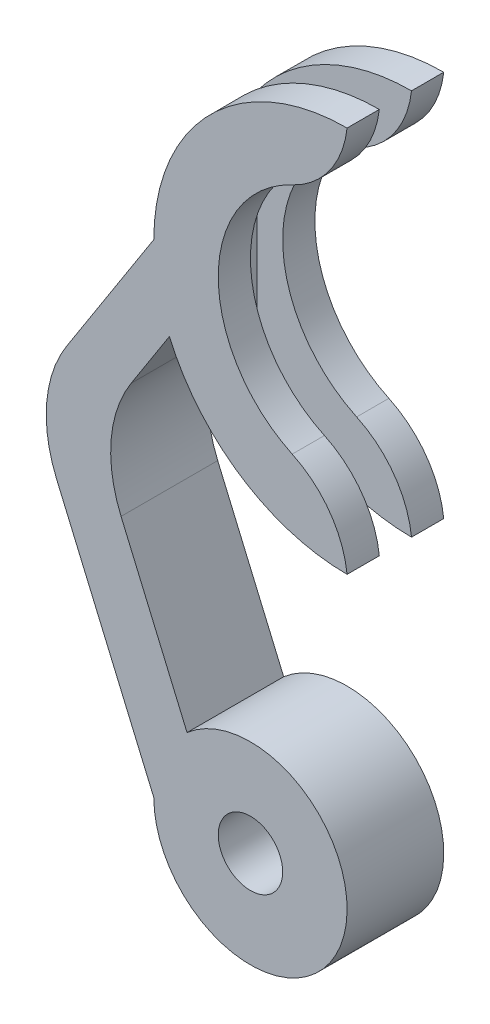
ISO-10303-21;
HEADER;
FILE_DESCRIPTION(('STEP AP214'),'2;1');
FILE_NAME('part.step','',(''),(''),'','','');
FILE_SCHEMA(('AUTOMOTIVE_DESIGN { 1 0 10303 214 1 1 1 1 }'));
ENDSEC;
DATA;
#1=APPLICATION_CONTEXT('core data for automotive mechanical design processes');
#2=APPLICATION_PROTOCOL_DEFINITION('international standard','automotive_design',2000,#1);
#3=PRODUCT_CONTEXT('',#1,'mechanical');
#4=PRODUCT('Part','Part','',(#3));
#5=PRODUCT_RELATED_PRODUCT_CATEGORY('part','',(#4));
#6=PRODUCT_DEFINITION_FORMATION('','',#4);
#7=PRODUCT_DEFINITION_CONTEXT('part definition',#1,'design');
#8=PRODUCT_DEFINITION('design','',#6,#7);
#9=PRODUCT_DEFINITION_SHAPE('','',#8);
#10=(LENGTH_UNIT() NAMED_UNIT(*) SI_UNIT(.MILLI.,.METRE.));
#11=(NAMED_UNIT(*) PLANE_ANGLE_UNIT() SI_UNIT($,.RADIAN.));
#12=(NAMED_UNIT(*) SI_UNIT($,.STERADIAN.) SOLID_ANGLE_UNIT());
#13=UNCERTAINTY_MEASURE_WITH_UNIT(LENGTH_MEASURE(1.E-05),#10,'distance_accuracy_value','');
#14=(GEOMETRIC_REPRESENTATION_CONTEXT(3) GLOBAL_UNCERTAINTY_ASSIGNED_CONTEXT((#13)) GLOBAL_UNIT_ASSIGNED_CONTEXT((#10,
#11,#12)) REPRESENTATION_CONTEXT('',''));
#15=CARTESIAN_POINT('',(0.,0.,0.));
#16=DIRECTION('',(0.,0.,1.));
#17=DIRECTION('',(1.,0.,0.));
#18=AXIS2_PLACEMENT_3D('',#15,#16,#17);
#19=CARTESIAN_POINT('',(0.,-30.,15.));
#20=DIRECTION('',(0.,0.,-1.));
#21=DIRECTION('',(-1.,0.,0.));
#22=AXIS2_PLACEMENT_3D('',#19,#20,#21);
#23=CYLINDRICAL_SURFACE('',#22,20.);
#24=CARTESIAN_POINT('',(0.,-30.,10.));
#25=DIRECTION('',(0.,0.,1.));
#26=DIRECTION('',(0.,-1.,0.));
#27=AXIS2_PLACEMENT_3D('',#24,#25,#26);
#28=CIRCLE('',#27,20.);
#29=CARTESIAN_POINT('',(-8.5183541999992,-11.9047619047619,10.));
#30=VERTEX_POINT('',#29);
#31=CARTESIAN_POINT('',(-8.5183541999992,-48.0952380952381,9.99999999999999));
#32=VERTEX_POINT('',#31);
#33=EDGE_CURVE('E170',#30,#32,#28,.T.);
#34=ORIENTED_EDGE('',*,*,#33,.F.);
#35=DIRECTION('',(0.,0.,-1.));
#36=VECTOR('',#35,1.);
#37=CARTESIAN_POINT('',(-8.5183541999992,-11.9047619047619,15.));
#38=LINE('',#37,#36);
#39=CARTESIAN_POINT('',(-8.5183541999992,-11.9047619047619,15.));
#40=VERTEX_POINT('',#39);
#41=EDGE_CURVE('E226',#30,#40,#38,.F.);
#42=ORIENTED_EDGE('',*,*,#41,.T.);
#43=CARTESIAN_POINT('',(0.,-30.,15.));
#44=DIRECTION('',(0.,0.,1.));
#45=DIRECTION('',(1.,0.,0.));
#46=AXIS2_PLACEMENT_3D('',#43,#44,#45);
#47=CIRCLE('',#46,20.);
#48=CARTESIAN_POINT('',(-8.5183541999992,-48.0952380952381,15.));
#49=VERTEX_POINT('',#48);
#50=EDGE_CURVE('E258',#40,#49,#47,.T.);
#51=ORIENTED_EDGE('',*,*,#50,.T.);
#52=DIRECTION('',(0.,0.,-1.));
#53=VECTOR('',#52,1.);
#54=CARTESIAN_POINT('',(-8.5183541999992,-48.0952380952381,15.));
#55=LINE('',#54,#53);
#56=EDGE_CURVE('E231',#49,#32,#55,.T.);
#57=ORIENTED_EDGE('',*,*,#56,.T.);
#58=EDGE_LOOP('',(#34,#42,#51,#57));
#59=FACE_BOUND('',#58,.T.);
#60=ADVANCED_FACE('F39',(#59),#23,.F.);
#61=CARTESIAN_POINT('',(-14.9071198499986,-61.6666666666667,15.));
#62=DIRECTION('',(0.,0.,-1.));
#63=DIRECTION('',(-1.,0.,0.));
#64=AXIS2_PLACEMENT_3D('',#61,#62,#63);
#65=CYLINDRICAL_SURFACE('',#64,15.);
#66=CARTESIAN_POINT('',(-14.9071198499986,-61.6666666666667,9.99999999999999));
#67=DIRECTION('',(0.,0.,1.));
#68=DIRECTION('',(0.,-1.,0.));
#69=AXIS2_PLACEMENT_3D('',#66,#67,#68);
#70=CIRCLE('',#69,15.);
#71=CARTESIAN_POINT('',(0.,-60.,9.99999999999999));
#72=VERTEX_POINT('',#71);
#73=EDGE_CURVE('E163',#32,#72,#70,.F.);
#74=ORIENTED_EDGE('',*,*,#73,.F.);
#75=ORIENTED_EDGE('',*,*,#56,.F.);
#76=CARTESIAN_POINT('',(-14.9071198499986,-61.6666666666667,15.));
#77=DIRECTION('',(0.,0.,1.));
#78=DIRECTION('',(1.,0.,0.));
#79=AXIS2_PLACEMENT_3D('',#76,#77,#78);
#80=CIRCLE('',#79,15.);
#81=CARTESIAN_POINT('',(0.,-60.,15.));
#82=VERTEX_POINT('',#81);
#83=EDGE_CURVE('E62',#82,#49,#80,.T.);
#84=ORIENTED_EDGE('',*,*,#83,.F.);
#85=DIRECTION('',(0.,0.,-1.));
#86=VECTOR('',#85,1.);
#87=CARTESIAN_POINT('',(0.,-60.,15.));
#88=LINE('',#87,#86);
#89=EDGE_CURVE('E181',#82,#72,#88,.T.);
#90=ORIENTED_EDGE('',*,*,#89,.T.);
#91=EDGE_LOOP('',(#74,#75,#84,#90));
#92=FACE_BOUND('',#91,.T.);
#93=ADVANCED_FACE('F185',(#92),#65,.T.);
#94=CARTESIAN_POINT('',(-14.9071198499986,1.66666666666667,15.));
#95=DIRECTION('',(0.,0.,-1.));
#96=DIRECTION('',(-1.,0.,0.));
#97=AXIS2_PLACEMENT_3D('',#94,#95,#96);
#98=CYLINDRICAL_SURFACE('',#97,15.);
#99=CARTESIAN_POINT('',(-14.9071198499986,1.66666666666667,10.));
#100=DIRECTION('',(0.,0.,1.));
#101=DIRECTION('',(0.,-1.,0.));
#102=AXIS2_PLACEMENT_3D('',#99,#100,#101);
#103=CIRCLE('',#102,15.);
#104=CARTESIAN_POINT('',(0.,0.,10.));
#105=VERTEX_POINT('',#104);
#106=EDGE_CURVE('E47',#105,#30,#103,.F.);
#107=ORIENTED_EDGE('',*,*,#106,.F.);
#108=DIRECTION('',(0.,0.,-1.));
#109=VECTOR('',#108,1.);
#110=CARTESIAN_POINT('',(0.,0.,15.));
#111=LINE('',#110,#109);
#112=CARTESIAN_POINT('',(0.,0.,15.));
#113=VERTEX_POINT('',#112);
#114=EDGE_CURVE('E205',#113,#105,#111,.T.);
#115=ORIENTED_EDGE('',*,*,#114,.F.);
#116=CARTESIAN_POINT('',(-14.9071198499986,1.66666666666667,15.));
#117=DIRECTION('',(0.,0.,1.));
#118=DIRECTION('',(1.,0.,0.));
#119=AXIS2_PLACEMENT_3D('',#116,#117,#118);
#120=CIRCLE('',#119,15.);
#121=EDGE_CURVE('E238',#40,#113,#120,.T.);
#122=ORIENTED_EDGE('',*,*,#121,.F.);
#123=ORIENTED_EDGE('',*,*,#41,.F.);
#124=EDGE_LOOP('',(#107,#115,#122,#123));
#125=FACE_BOUND('',#124,.T.);
#126=ADVANCED_FACE('F251',(#125),#98,.T.);
#127=CARTESIAN_POINT('',(0.,-30.,5.));
#128=DIRECTION('',(0.,0.,-1.));
#129=DIRECTION('',(0.,1.,0.));
#130=AXIS2_PLACEMENT_3D('',#127,#128,#129);
#131=CIRCLE('',#130,20.);
#132=CARTESIAN_POINT('',(-8.5183541999992,-48.0952380952381,5.));
#133=VERTEX_POINT('',#132);
#134=CARTESIAN_POINT('',(-8.5183541999992,-11.9047619047619,5.));
#135=VERTEX_POINT('',#134);
#136=EDGE_CURVE('E54',#133,#135,#131,.T.);
#137=ORIENTED_EDGE('',*,*,#136,.F.);
#138=CARTESIAN_POINT('',(-8.5183541999992,-48.0952380952381,0.));
#139=VERTEX_POINT('',#138);
#140=EDGE_CURVE('E230',#133,#139,#55,.T.);
#141=ORIENTED_EDGE('',*,*,#140,.T.);
#142=CARTESIAN_POINT('',(0.,-30.,0.));
#143=DIRECTION('',(0.,0.,1.));
#144=DIRECTION('',(1.,0.,0.));
#145=AXIS2_PLACEMENT_3D('',#142,#143,#144);
#146=CIRCLE('',#145,20.);
#147=CARTESIAN_POINT('',(-8.5183541999992,-11.9047619047619,0.));
#148=VERTEX_POINT('',#147);
#149=EDGE_CURVE('E283',#148,#139,#146,.T.);
#150=ORIENTED_EDGE('',*,*,#149,.F.);
#151=EDGE_CURVE('E227',#148,#135,#38,.F.);
#152=ORIENTED_EDGE('',*,*,#151,.T.);
#153=EDGE_LOOP('',(#137,#141,#150,#152));
#154=FACE_BOUND('',#153,.T.);
#155=ADVANCED_FACE('F368',(#154),#23,.F.);
#156=CARTESIAN_POINT('',(0.,-30.,15.));
#157=DIRECTION('',(0.,0.,-1.));
#158=DIRECTION('',(-1.,0.,0.));
#159=AXIS2_PLACEMENT_3D('',#156,#157,#158);
#160=CYLINDRICAL_SURFACE('',#159,30.);
#161=ORIENTED_EDGE('',*,*,#114,.T.);
#162=CARTESIAN_POINT('',(0.,-30.,10.));
#163=DIRECTION('',(0.,0.,1.));
#164=DIRECTION('',(0.,-1.,0.));
#165=AXIS2_PLACEMENT_3D('',#162,#163,#164);
#166=CIRCLE('',#165,30.);
#167=CARTESIAN_POINT('',(-24.,-12.,10.));
#168=VERTEX_POINT('',#167);
#169=EDGE_CURVE('E244',#105,#168,#166,.T.);
#170=ORIENTED_EDGE('',*,*,#169,.T.);
#171=DIRECTION('',(0.,0.,-1.));
#172=VECTOR('',#171,1.);
#173=CARTESIAN_POINT('',(-24.,-12.,15.));
#174=LINE('',#173,#172);
#175=CARTESIAN_POINT('',(-24.,-12.,5.));
#176=VERTEX_POINT('',#175);
#177=EDGE_CURVE('E183',#176,#168,#174,.F.);
#178=ORIENTED_EDGE('',*,*,#177,.F.);
#179=CARTESIAN_POINT('',(0.,-30.,5.));
#180=DIRECTION('',(0.,0.,-1.));
#181=DIRECTION('',(0.,1.,0.));
#182=AXIS2_PLACEMENT_3D('',#179,#180,#181);
#183=CIRCLE('',#182,30.);
#184=CARTESIAN_POINT('',(0.,0.,5.));
#185=VERTEX_POINT('',#184);
#186=EDGE_CURVE('E315',#176,#185,#183,.T.);
#187=ORIENTED_EDGE('',*,*,#186,.T.);
#188=CARTESIAN_POINT('',(0.,0.,0.));
#189=VERTEX_POINT('',#188);
#190=EDGE_CURVE('E204',#185,#189,#111,.T.);
#191=ORIENTED_EDGE('',*,*,#190,.T.);
#192=CARTESIAN_POINT('',(0.,-30.,0.));
#193=DIRECTION('',(0.,0.,1.));
#194=DIRECTION('',(1.,0.,0.));
#195=AXIS2_PLACEMENT_3D('',#192,#193,#194);
#196=CIRCLE('',#195,30.);
#197=CARTESIAN_POINT('',(-30.,-30.,0.));
#198=VERTEX_POINT('',#197);
#199=EDGE_CURVE('E286',#189,#198,#196,.T.);
#200=ORIENTED_EDGE('',*,*,#199,.T.);
#201=DIRECTION('',(0.,0.,-1.));
#202=VECTOR('',#201,1.);
#203=CARTESIAN_POINT('',(-30.,-30.,15.));
#204=LINE('',#203,#202);
#205=CARTESIAN_POINT('',(-30.,-30.,15.));
#206=VERTEX_POINT('',#205);
#207=EDGE_CURVE('E201',#206,#198,#204,.T.);
#208=ORIENTED_EDGE('',*,*,#207,.F.);
#209=CARTESIAN_POINT('',(0.,-30.,15.));
#210=DIRECTION('',(0.,0.,1.));
#211=DIRECTION('',(1.,0.,0.));
#212=AXIS2_PLACEMENT_3D('',#209,#210,#211);
#213=CIRCLE('',#212,30.);
#214=EDGE_CURVE('E256',#113,#206,#213,.T.);
#215=ORIENTED_EDGE('',*,*,#214,.F.);
#216=EDGE_LOOP('',(#161,#170,#178,#187,#191,#200,#208,#215));
#217=FACE_BOUND('',#216,.T.);
#218=ADVANCED_FACE('F260',(#217),#160,.T.);
#219=CARTESIAN_POINT('',(-7.61037112589277,4.88450112783725,15.));
#220=DIRECTION('',(0.841574637744924,-0.540140841914865,0.));
#221=DIRECTION('',(0.540140841914866,0.841574637744924,0.));
#222=AXIS2_PLACEMENT_3D('',#219,#220,#221);
#223=PLANE('',#222);
#224=DIRECTION('',(-0.540140841914866,-0.841574637744924,0.));
#225=VECTOR('',#224,1.);
#226=CARTESIAN_POINT('',(-7.61037112589277,4.88450112783725,0.));
#227=LINE('',#226,#225);
#228=CARTESIAN_POINT('',(-43.5278029245234,-51.0771986901241,0.));
#229=VERTEX_POINT('',#228);
#230=EDGE_CURVE('E288',#198,#229,#227,.T.);
#231=ORIENTED_EDGE('',*,*,#230,.T.);
#232=DIRECTION('',(0.,0.,-1.));
#233=VECTOR('',#232,1.);
#234=CARTESIAN_POINT('',(-43.5278029245234,-51.0771986901241,15.));
#235=LINE('',#234,#233);
#236=CARTESIAN_POINT('',(-43.5278029245234,-51.0771986901241,15.));
#237=VERTEX_POINT('',#236);
#238=EDGE_CURVE('E218',#229,#237,#235,.F.);
#239=ORIENTED_EDGE('',*,*,#238,.T.);
#240=DIRECTION('',(-0.540140841914866,-0.841574637744924,0.));
#241=VECTOR('',#240,1.);
#242=CARTESIAN_POINT('',(-7.61037112589277,4.88450112783725,15.));
#243=LINE('',#242,#241);
#244=EDGE_CURVE('E262',#206,#237,#243,.T.);
#245=ORIENTED_EDGE('',*,*,#244,.F.);
#246=ORIENTED_EDGE('',*,*,#207,.T.);
#247=EDGE_LOOP('',(#231,#239,#245,#246));
#248=FACE_BOUND('',#247,.T.);
#249=ADVANCED_FACE('F336',(#248),#223,.F.);
#250=CARTESIAN_POINT('',(-63.3324666824997,-27.0987664790654,15.));
#251=DIRECTION('',(0.919374663063813,0.393383056214041,0.));
#252=DIRECTION('',(-0.393383056214041,0.919374663063813,0.));
#253=AXIS2_PLACEMENT_3D('',#250,#251,#252);
#254=PLANE('',#253);
#255=DIRECTION('',(0.393383056214041,-0.919374663063813,0.));
#256=VECTOR('',#255,1.);
#257=CARTESIAN_POINT('',(-63.3324666824997,-27.0987664790654,15.));
#258=LINE('',#257,#256);
#259=CARTESIAN_POINT('',(-45.0838034309012,-69.7476766527022,15.));
#260=VERTEX_POINT('',#259);
#261=CARTESIAN_POINT('',(-30.,-105.,15.));
#262=VERTEX_POINT('',#261);
#263=EDGE_CURVE('E264',#260,#262,#258,.T.);
#264=ORIENTED_EDGE('',*,*,#263,.F.);
#265=DIRECTION('',(0.,0.,-1.));
#266=VECTOR('',#265,1.);
#267=CARTESIAN_POINT('',(-45.0838034309012,-69.7476766527022,15.));
#268=LINE('',#267,#266);
#269=CARTESIAN_POINT('',(-45.0838034309012,-69.7476766527022,0.));
#270=VERTEX_POINT('',#269);
#271=EDGE_CURVE('E213',#260,#270,#268,.T.);
#272=ORIENTED_EDGE('',*,*,#271,.T.);
#273=DIRECTION('',(0.393383056214041,-0.919374663063813,0.));
#274=VECTOR('',#273,1.);
#275=CARTESIAN_POINT('',(-63.3324666824997,-27.0987664790654,0.));
#276=LINE('',#275,#274);
#277=CARTESIAN_POINT('',(-30.,-105.,0.));
#278=VERTEX_POINT('',#277);
#279=EDGE_CURVE('E291',#270,#278,#276,.T.);
#280=ORIENTED_EDGE('',*,*,#279,.T.);
#281=DIRECTION('',(0.,0.,-1.));
#282=VECTOR('',#281,1.);
#283=CARTESIAN_POINT('',(-30.,-105.,15.));
#284=LINE('',#283,#282);
#285=EDGE_CURVE('E198',#262,#278,#284,.T.);
#286=ORIENTED_EDGE('',*,*,#285,.F.);
#287=EDGE_LOOP('',(#264,#272,#280,#286));
#288=FACE_BOUND('',#287,.T.);
#289=ADVANCED_FACE('F343',(#288),#254,.F.);
#290=CARTESIAN_POINT('',(-15.,-105.,15.));
#291=DIRECTION('',(0.,0.,-1.));
#292=DIRECTION('',(-1.,0.,0.));
#293=AXIS2_PLACEMENT_3D('',#290,#291,#292);
#294=CYLINDRICAL_SURFACE('',#293,15.);
#295=CARTESIAN_POINT('',(-15.,-105.,0.));
#296=DIRECTION('',(0.,0.,1.));
#297=DIRECTION('',(1.,0.,0.));
#298=AXIS2_PLACEMENT_3D('',#295,#296,#297);
#299=CIRCLE('',#298,15.);
#300=CARTESIAN_POINT('',(-24.843075060403,-93.6812600809423,0.));
#301=VERTEX_POINT('',#300);
#302=EDGE_CURVE('E293',#278,#301,#299,.T.);
#303=ORIENTED_EDGE('',*,*,#302,.T.);
#304=DIRECTION('',(0.,0.,-1.));
#305=VECTOR('',#304,1.);
#306=CARTESIAN_POINT('',(-24.843075060403,-93.6812600809423,15.));
#307=LINE('',#306,#305);
#308=CARTESIAN_POINT('',(-24.843075060403,-93.6812600809423,15.));
#309=VERTEX_POINT('',#308);
#310=EDGE_CURVE('E189',#309,#301,#307,.T.);
#311=ORIENTED_EDGE('',*,*,#310,.F.);
#312=CARTESIAN_POINT('',(-15.,-105.,15.));
#313=DIRECTION('',(0.,0.,1.));
#314=DIRECTION('',(1.,0.,0.));
#315=AXIS2_PLACEMENT_3D('',#312,#313,#314);
#316=CIRCLE('',#315,15.);
#317=EDGE_CURVE('E271',#262,#309,#316,.T.);
#318=ORIENTED_EDGE('',*,*,#317,.F.);
#319=ORIENTED_EDGE('',*,*,#285,.T.);
#320=EDGE_LOOP('',(#303,#311,#318,#319));
#321=FACE_BOUND('',#320,.T.);
#322=ADVANCED_FACE('F350',(#321),#294,.T.);
#323=CARTESIAN_POINT('',(-54.8799689716627,-23.4821023314474,15.));
#324=DIRECTION('',(0.919374663063814,0.393383056214041,0.));
#325=DIRECTION('',(-0.393383056214041,0.919374663063814,0.));
#326=AXIS2_PLACEMENT_3D('',#323,#324,#325);
#327=PLANE('',#326);
#328=DIRECTION('',(0.393383056214041,-0.919374663063814,0.));
#329=VECTOR('',#328,1.);
#330=CARTESIAN_POINT('',(-54.8799689716627,-23.4821023314474,0.));
#331=LINE('',#330,#329);
#332=CARTESIAN_POINT('',(-35.0838034309012,-69.7476766527022,0.));
#333=VERTEX_POINT('',#332);
#334=EDGE_CURVE('E296',#333,#301,#331,.T.);
#335=ORIENTED_EDGE('',*,*,#334,.F.);
#336=DIRECTION('',(0.,0.,-1.));
#337=VECTOR('',#336,1.);
#338=CARTESIAN_POINT('',(-35.0838034309012,-69.7476766527022,15.));
#339=LINE('',#338,#337);
#340=CARTESIAN_POINT('',(-35.0838034309012,-69.7476766527022,15.));
#341=VERTEX_POINT('',#340);
#342=EDGE_CURVE('E211',#333,#341,#339,.F.);
#343=ORIENTED_EDGE('',*,*,#342,.T.);
#344=DIRECTION('',(0.393383056214041,-0.919374663063814,0.));
#345=VECTOR('',#344,1.);
#346=CARTESIAN_POINT('',(-54.8799689716627,-23.4821023314474,15.));
#347=LINE('',#346,#345);
#348=EDGE_CURVE('E274',#341,#309,#347,.T.);
#349=ORIENTED_EDGE('',*,*,#348,.T.);
#350=ORIENTED_EDGE('',*,*,#310,.T.);
#351=EDGE_LOOP('',(#335,#343,#349,#350));
#352=FACE_BOUND('',#351,.T.);
#353=ADVANCED_FACE('F413',(#352),#327,.T.);
#354=CARTESIAN_POINT('',(-0.52789241693777,0.338812794179835,15.));
#355=DIRECTION('',(0.841574637744924,-0.540140841914865,0.));
#356=DIRECTION('',(0.540140841914865,0.841574637744924,0.));
#357=AXIS2_PLACEMENT_3D('',#354,#355,#356);
#358=PLANE('',#357);
#359=DIRECTION('',(-0.540140841914866,-0.841574637744924,0.));
#360=VECTOR('',#359,1.);
#361=CARTESIAN_POINT('',(-0.52789241693777,0.338812794179835,15.));
#362=LINE('',#361,#360);
#363=CARTESIAN_POINT('',(-27.5785246722631,-41.8078354028745,15.));
#364=VERTEX_POINT('',#363);
#365=CARTESIAN_POINT('',(-33.5278029245234,-51.0771986901241,15.));
#366=VERTEX_POINT('',#365);
#367=EDGE_CURVE('E276',#364,#366,#362,.T.);
#368=ORIENTED_EDGE('',*,*,#367,.T.);
#369=DIRECTION('',(0.,0.,-1.));
#370=VECTOR('',#369,1.);
#371=CARTESIAN_POINT('',(-33.5278029245234,-51.0771986901241,0.));
#372=LINE('',#371,#370);
#373=CARTESIAN_POINT('',(-33.5278029245234,-51.0771986901241,0.));
#374=VERTEX_POINT('',#373);
#375=EDGE_CURVE('E208',#366,#374,#372,.T.);
#376=ORIENTED_EDGE('',*,*,#375,.T.);
#377=DIRECTION('',(-0.540140841914866,-0.841574637744924,0.));
#378=VECTOR('',#377,1.);
#379=CARTESIAN_POINT('',(-0.52789241693777,0.338812794179835,0.));
#380=LINE('',#379,#378);
#381=CARTESIAN_POINT('',(-27.5785246722631,-41.8078354028745,0.));
#382=VERTEX_POINT('',#381);
#383=EDGE_CURVE('E297',#382,#374,#380,.T.);
#384=ORIENTED_EDGE('',*,*,#383,.F.);
#385=DIRECTION('',(0.,0.,-1.));
#386=VECTOR('',#385,1.);
#387=CARTESIAN_POINT('',(-27.5785246722631,-41.8078354028745,15.));
#388=LINE('',#387,#386);
#389=EDGE_CURVE('E186',#364,#382,#388,.T.);
#390=ORIENTED_EDGE('',*,*,#389,.F.);
#391=EDGE_LOOP('',(#368,#376,#384,#390));
#392=FACE_BOUND('',#391,.T.);
#393=ADVANCED_FACE('F360',(#392),#358,.T.);
#394=CARTESIAN_POINT('',(0.,-30.,15.));
#395=DIRECTION('',(0.,0.,-1.));
#396=DIRECTION('',(-1.,0.,0.));
#397=AXIS2_PLACEMENT_3D('',#394,#395,#396);
#398=CYLINDRICAL_SURFACE('',#397,30.);
#399=DIRECTION('',(0.,0.,-1.));
#400=VECTOR('',#399,1.);
#401=CARTESIAN_POINT('',(-24.,-48.,15.));
#402=LINE('',#401,#400);
#403=CARTESIAN_POINT('',(-24.,-48.,9.99999999999999));
#404=VERTEX_POINT('',#403);
#405=CARTESIAN_POINT('',(-24.,-48.,4.99999999999999));
#406=VERTEX_POINT('',#405);
#407=EDGE_CURVE('E11',#404,#406,#402,.T.);
#408=ORIENTED_EDGE('',*,*,#407,.F.);
#409=CARTESIAN_POINT('',(0.,-30.,10.));
#410=DIRECTION('',(0.,0.,1.));
#411=DIRECTION('',(0.,-1.,0.));
#412=AXIS2_PLACEMENT_3D('',#409,#410,#411);
#413=CIRCLE('',#412,30.);
#414=EDGE_CURVE('E167',#404,#72,#413,.T.);
#415=ORIENTED_EDGE('',*,*,#414,.T.);
#416=ORIENTED_EDGE('',*,*,#89,.F.);
#417=CARTESIAN_POINT('',(0.,-30.,15.));
#418=DIRECTION('',(0.,0.,1.));
#419=DIRECTION('',(1.,0.,0.));
#420=AXIS2_PLACEMENT_3D('',#417,#418,#419);
#421=CIRCLE('',#420,30.);
#422=EDGE_CURVE('E191',#364,#82,#421,.T.);
#423=ORIENTED_EDGE('',*,*,#422,.F.);
#424=ORIENTED_EDGE('',*,*,#389,.T.);
#425=CARTESIAN_POINT('',(0.,-30.,0.));
#426=DIRECTION('',(0.,0.,1.));
#427=DIRECTION('',(1.,0.,0.));
#428=AXIS2_PLACEMENT_3D('',#425,#426,#427);
#429=CIRCLE('',#428,30.);
#430=CARTESIAN_POINT('',(0.,-60.,0.));
#431=VERTEX_POINT('',#430);
#432=EDGE_CURVE('E193',#382,#431,#429,.T.);
#433=ORIENTED_EDGE('',*,*,#432,.T.);
#434=CARTESIAN_POINT('',(0.,-60.,4.99999999999999));
#435=VERTEX_POINT('',#434);
#436=EDGE_CURVE('E187',#435,#431,#88,.T.);
#437=ORIENTED_EDGE('',*,*,#436,.F.);
#438=CARTESIAN_POINT('',(0.,-30.,5.));
#439=DIRECTION('',(0.,0.,-1.));
#440=DIRECTION('',(0.,1.,0.));
#441=AXIS2_PLACEMENT_3D('',#438,#439,#440);
#442=CIRCLE('',#441,30.);
#443=EDGE_CURVE('E310',#435,#406,#442,.T.);
#444=ORIENTED_EDGE('',*,*,#443,.T.);
#445=EDGE_LOOP('',(#408,#415,#416,#423,#424,#433,#437,#444));
#446=FACE_BOUND('',#445,.T.);
#447=ADVANCED_FACE('F179',(#446),#398,.T.);
#448=CARTESIAN_POINT('',(-15.,-105.,15.));
#449=DIRECTION('',(0.,0.,-1.));
#450=DIRECTION('',(-1.,0.,0.));
#451=AXIS2_PLACEMENT_3D('',#448,#449,#450);
#452=CYLINDRICAL_SURFACE('',#451,5.);
#453=CARTESIAN_POINT('',(-15.,-105.,15.));
#454=DIRECTION('',(0.,0.,1.));
#455=DIRECTION('',(1.,0.,0.));
#456=AXIS2_PLACEMENT_3D('',#453,#454,#455);
#457=CIRCLE('',#456,5.);
#458=CARTESIAN_POINT('',(-9.99999999999999,-105.,15.));
#459=VERTEX_POINT('',#458);
#460=EDGE_CURVE('E266',#459,#459,#457,.T.);
#461=ORIENTED_EDGE('',*,*,#460,.T.);
#462=EDGE_LOOP('',(#461));
#463=FACE_BOUND('',#462,.T.);
#464=CARTESIAN_POINT('',(-15.,-105.,0.));
#465=DIRECTION('',(0.,0.,1.));
#466=DIRECTION('',(1.,0.,0.));
#467=AXIS2_PLACEMENT_3D('',#464,#465,#466);
#468=CIRCLE('',#467,5.);
#469=CARTESIAN_POINT('',(-9.99999999999999,-105.,0.));
#470=VERTEX_POINT('',#469);
#471=EDGE_CURVE('E280',#470,#470,#468,.T.);
#472=ORIENTED_EDGE('',*,*,#471,.F.);
#473=EDGE_LOOP('',(#472));
#474=FACE_BOUND('',#473,.T.);
#475=ADVANCED_FACE('F393',(#463,#474),#452,.F.);
#476=CARTESIAN_POINT('',(0.,0.,15.));
#477=DIRECTION('',(0.,0.,1.));
#478=DIRECTION('',(1.,0.,0.));
#479=AXIS2_PLACEMENT_3D('',#476,#477,#478);
#480=PLANE('',#479);
#481=ORIENTED_EDGE('',*,*,#460,.F.);
#482=EDGE_LOOP('',(#481));
#483=FACE_BOUND('',#482,.T.);
#484=ORIENTED_EDGE('',*,*,#422,.T.);
#485=ORIENTED_EDGE('',*,*,#83,.T.);
#486=ORIENTED_EDGE('',*,*,#50,.F.);
#487=ORIENTED_EDGE('',*,*,#121,.T.);
#488=ORIENTED_EDGE('',*,*,#214,.T.);
#489=ORIENTED_EDGE('',*,*,#244,.T.);
#490=CARTESIAN_POINT('',(-26.6963101696249,-61.8800155284214,15.));
#491=DIRECTION('',(0.,0.,1.));
#492=DIRECTION('',(1.,0.,0.));
#493=AXIS2_PLACEMENT_3D('',#490,#491,#492);
#494=CIRCLE('',#493,20.);
#495=EDGE_CURVE('E220',#237,#260,#494,.T.);
#496=ORIENTED_EDGE('',*,*,#495,.T.);
#497=ORIENTED_EDGE('',*,*,#263,.T.);
#498=ORIENTED_EDGE('',*,*,#317,.T.);
#499=ORIENTED_EDGE('',*,*,#348,.F.);
#500=CARTESIAN_POINT('',(-16.6963101696249,-61.8800155284214,15.));
#501=DIRECTION('',(0.,0.,1.));
#502=DIRECTION('',(1.,0.,0.));
#503=AXIS2_PLACEMENT_3D('',#500,#501,#502);
#504=CIRCLE('',#503,20.);
#505=EDGE_CURVE('E224',#341,#366,#504,.F.);
#506=ORIENTED_EDGE('',*,*,#505,.T.);
#507=ORIENTED_EDGE('',*,*,#367,.F.);
#508=EDGE_LOOP('',(#484,#485,#486,#487,#488,#489,#496,#497,#498,#499,#506,#507));
#509=FACE_BOUND('',#508,.T.);
#510=ADVANCED_FACE('F254',(#483,#509),#480,.T.);
#511=CARTESIAN_POINT('',(0.,0.,0.));
#512=DIRECTION('',(0.,0.,1.));
#513=DIRECTION('',(1.,0.,0.));
#514=AXIS2_PLACEMENT_3D('',#511,#512,#513);
#515=PLANE('',#514);
#516=ORIENTED_EDGE('',*,*,#471,.T.);
#517=EDGE_LOOP('',(#516));
#518=FACE_BOUND('',#517,.T.);
#519=ORIENTED_EDGE('',*,*,#149,.T.);
#520=CARTESIAN_POINT('',(-14.9071198499986,-61.6666666666667,0.));
#521=DIRECTION('',(0.,0.,1.));
#522=DIRECTION('',(1.,0.,0.));
#523=AXIS2_PLACEMENT_3D('',#520,#521,#522);
#524=CIRCLE('',#523,15.);
#525=EDGE_CURVE('E235',#139,#431,#524,.F.);
#526=ORIENTED_EDGE('',*,*,#525,.T.);
#527=ORIENTED_EDGE('',*,*,#432,.F.);
#528=ORIENTED_EDGE('',*,*,#383,.T.);
#529=CARTESIAN_POINT('',(-16.6963101696249,-61.8800155284214,0.));
#530=DIRECTION('',(0.,0.,1.));
#531=DIRECTION('',(1.,0.,0.));
#532=AXIS2_PLACEMENT_3D('',#529,#530,#531);
#533=CIRCLE('',#532,20.);
#534=EDGE_CURVE('E222',#374,#333,#533,.T.);
#535=ORIENTED_EDGE('',*,*,#534,.T.);
#536=ORIENTED_EDGE('',*,*,#334,.T.);
#537=ORIENTED_EDGE('',*,*,#302,.F.);
#538=ORIENTED_EDGE('',*,*,#279,.F.);
#539=CARTESIAN_POINT('',(-26.6963101696249,-61.8800155284214,0.));
#540=DIRECTION('',(0.,0.,1.));
#541=DIRECTION('',(1.,0.,0.));
#542=AXIS2_PLACEMENT_3D('',#539,#540,#541);
#543=CIRCLE('',#542,20.);
#544=EDGE_CURVE('E216',#270,#229,#543,.F.);
#545=ORIENTED_EDGE('',*,*,#544,.T.);
#546=ORIENTED_EDGE('',*,*,#230,.F.);
#547=ORIENTED_EDGE('',*,*,#199,.F.);
#548=CARTESIAN_POINT('',(-14.9071198499986,1.66666666666667,0.));
#549=DIRECTION('',(0.,0.,1.));
#550=DIRECTION('',(1.,0.,0.));
#551=AXIS2_PLACEMENT_3D('',#548,#549,#550);
#552=CIRCLE('',#551,15.);
#553=EDGE_CURVE('E233',#189,#148,#552,.F.);
#554=ORIENTED_EDGE('',*,*,#553,.T.);
#555=EDGE_LOOP('',(#519,#526,#527,#528,#535,#536,#537,#538,#545,#546,#547,#554));
#556=FACE_BOUND('',#555,.T.);
#557=ADVANCED_FACE('F332',(#518,#556),#515,.F.);
#558=CARTESIAN_POINT('',(-16.6963101696249,-61.8800155284214,15.));
#559=DIRECTION('',(0.,0.,1.));
#560=DIRECTION('',(1.,0.,0.));
#561=AXIS2_PLACEMENT_3D('',#558,#559,#560);
#562=CYLINDRICAL_SURFACE('',#561,20.);
#563=ORIENTED_EDGE('',*,*,#505,.F.);
#564=ORIENTED_EDGE('',*,*,#342,.F.);
#565=ORIENTED_EDGE('',*,*,#534,.F.);
#566=ORIENTED_EDGE('',*,*,#375,.F.);
#567=EDGE_LOOP('',(#563,#564,#565,#566));
#568=FACE_BOUND('',#567,.T.);
#569=ADVANCED_FACE('F358',(#568),#562,.F.);
#570=CARTESIAN_POINT('',(-26.6963101696249,-61.8800155284214,15.));
#571=DIRECTION('',(0.,0.,-1.));
#572=DIRECTION('',(-1.,0.,0.));
#573=AXIS2_PLACEMENT_3D('',#570,#571,#572);
#574=CYLINDRICAL_SURFACE('',#573,20.);
#575=ORIENTED_EDGE('',*,*,#495,.F.);
#576=ORIENTED_EDGE('',*,*,#238,.F.);
#577=ORIENTED_EDGE('',*,*,#544,.F.);
#578=ORIENTED_EDGE('',*,*,#271,.F.);
#579=EDGE_LOOP('',(#575,#576,#577,#578));
#580=FACE_BOUND('',#579,.T.);
#581=ADVANCED_FACE('F341',(#580),#574,.T.);
#582=CARTESIAN_POINT('',(-14.9071198499986,-61.6666666666667,4.99999999999999));
#583=DIRECTION('',(0.,0.,-1.));
#584=DIRECTION('',(0.,1.,0.));
#585=AXIS2_PLACEMENT_3D('',#582,#583,#584);
#586=CIRCLE('',#585,15.);
#587=EDGE_CURVE('E312',#435,#133,#586,.F.);
#588=ORIENTED_EDGE('',*,*,#587,.F.);
#589=ORIENTED_EDGE('',*,*,#436,.T.);
#590=ORIENTED_EDGE('',*,*,#525,.F.);
#591=ORIENTED_EDGE('',*,*,#140,.F.);
#592=EDGE_LOOP('',(#588,#589,#590,#591));
#593=FACE_BOUND('',#592,.T.);
#594=ADVANCED_FACE('F365',(#593),#65,.T.);
#595=CARTESIAN_POINT('',(-14.9071198499986,1.66666666666667,5.));
#596=DIRECTION('',(0.,0.,-1.));
#597=DIRECTION('',(0.,1.,0.));
#598=AXIS2_PLACEMENT_3D('',#595,#596,#597);
#599=CIRCLE('',#598,15.);
#600=EDGE_CURVE('E241',#135,#185,#599,.F.);
#601=ORIENTED_EDGE('',*,*,#600,.F.);
#602=ORIENTED_EDGE('',*,*,#151,.F.);
#603=ORIENTED_EDGE('',*,*,#553,.F.);
#604=ORIENTED_EDGE('',*,*,#190,.F.);
#605=EDGE_LOOP('',(#601,#602,#603,#604));
#606=FACE_BOUND('',#605,.T.);
#607=ADVANCED_FACE('F41',(#606),#98,.T.);
#608=CARTESIAN_POINT('',(-24.,0.,0.));
#609=DIRECTION('',(1.,0.,0.));
#610=DIRECTION('',(0.,0.,-1.));
#611=AXIS2_PLACEMENT_3D('',#608,#609,#610);
#612=PLANE('',#611);
#613=ORIENTED_EDGE('',*,*,#177,.T.);
#614=DIRECTION('',(0.,-1.,0.));
#615=VECTOR('',#614,1.);
#616=CARTESIAN_POINT('',(-24.,0.,10.));
#617=LINE('',#616,#615);
#618=EDGE_CURVE('E321',#168,#404,#617,.T.);
#619=ORIENTED_EDGE('',*,*,#618,.T.);
#620=ORIENTED_EDGE('',*,*,#407,.T.);
#621=DIRECTION('',(0.,1.,0.));
#622=VECTOR('',#621,1.);
#623=CARTESIAN_POINT('',(-24.,0.,5.));
#624=LINE('',#623,#622);
#625=EDGE_CURVE('E318',#406,#176,#624,.T.);
#626=ORIENTED_EDGE('',*,*,#625,.T.);
#627=EDGE_LOOP('',(#613,#619,#620,#626));
#628=FACE_BOUND('',#627,.T.);
#629=ADVANCED_FACE('F323',(#628),#612,.T.);
#630=CARTESIAN_POINT('',(-24.,0.,10.));
#631=DIRECTION('',(0.,0.,1.));
#632=DIRECTION('',(0.,-1.,0.));
#633=AXIS2_PLACEMENT_3D('',#630,#631,#632);
#634=PLANE('',#633);
#635=ORIENTED_EDGE('',*,*,#618,.F.);
#636=ORIENTED_EDGE('',*,*,#169,.F.);
#637=ORIENTED_EDGE('',*,*,#106,.T.);
#638=ORIENTED_EDGE('',*,*,#33,.T.);
#639=ORIENTED_EDGE('',*,*,#73,.T.);
#640=ORIENTED_EDGE('',*,*,#414,.F.);
#641=EDGE_LOOP('',(#635,#636,#637,#638,#639,#640));
#642=FACE_BOUND('',#641,.T.);
#643=ADVANCED_FACE('F166',(#642),#634,.F.);
#644=CARTESIAN_POINT('',(-24.,0.,5.));
#645=DIRECTION('',(0.,0.,-1.));
#646=DIRECTION('',(0.,1.,0.));
#647=AXIS2_PLACEMENT_3D('',#644,#645,#646);
#648=PLANE('',#647);
#649=ORIENTED_EDGE('',*,*,#587,.T.);
#650=ORIENTED_EDGE('',*,*,#136,.T.);
#651=ORIENTED_EDGE('',*,*,#600,.T.);
#652=ORIENTED_EDGE('',*,*,#186,.F.);
#653=ORIENTED_EDGE('',*,*,#625,.F.);
#654=ORIENTED_EDGE('',*,*,#443,.F.);
#655=EDGE_LOOP('',(#649,#650,#651,#652,#653,#654));
#656=FACE_BOUND('',#655,.T.);
#657=ADVANCED_FACE('F366',(#656),#648,.F.);
#658=CLOSED_SHELL('',(#60,#93,#126,#155,#218,#249,#289,#322,#353,#393,#447,#475,#510,#557,#569,
#581,#594,#607,#629,#643,#657));
#659=MANIFOLD_SOLID_BREP('B2',#658);
#660=ADVANCED_BREP_SHAPE_REPRESENTATION('',(#18,#659),#14);
#661=SHAPE_DEFINITION_REPRESENTATION(#9,#660);
ENDSEC;
END-ISO-10303-21;
